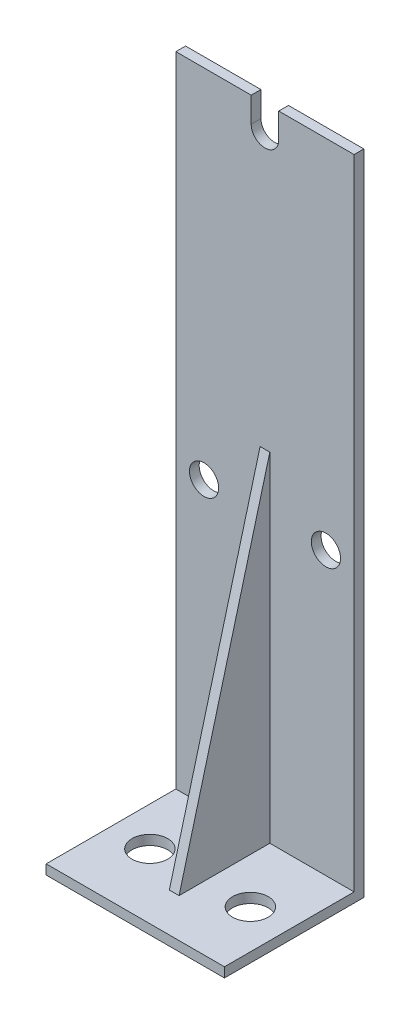
ISO-10303-21;
HEADER;
FILE_DESCRIPTION(('STEP AP214'),'2;1');
FILE_NAME('part.step','',(''),(''),'','','');
FILE_SCHEMA(('AUTOMOTIVE_DESIGN { 1 0 10303 214 1 1 1 1 }'));
ENDSEC;
DATA;
#1=APPLICATION_CONTEXT('core data for automotive mechanical design processes');
#2=APPLICATION_PROTOCOL_DEFINITION('international standard','automotive_design',2000,#1);
#3=PRODUCT_CONTEXT('',#1,'mechanical');
#4=PRODUCT('Part','Part','',(#3));
#5=PRODUCT_RELATED_PRODUCT_CATEGORY('part','',(#4));
#6=PRODUCT_DEFINITION_FORMATION('','',#4);
#7=PRODUCT_DEFINITION_CONTEXT('part definition',#1,'design');
#8=PRODUCT_DEFINITION('design','',#6,#7);
#9=PRODUCT_DEFINITION_SHAPE('','',#8);
#10=(LENGTH_UNIT() NAMED_UNIT(*) SI_UNIT(.MILLI.,.METRE.));
#11=(NAMED_UNIT(*) PLANE_ANGLE_UNIT() SI_UNIT($,.RADIAN.));
#12=(NAMED_UNIT(*) SI_UNIT($,.STERADIAN.) SOLID_ANGLE_UNIT());
#13=UNCERTAINTY_MEASURE_WITH_UNIT(LENGTH_MEASURE(1.E-05),#10,'distance_accuracy_value','');
#14=(GEOMETRIC_REPRESENTATION_CONTEXT(3) GLOBAL_UNCERTAINTY_ASSIGNED_CONTEXT((#13)) GLOBAL_UNIT_ASSIGNED_CONTEXT((#10,
#11,#12)) REPRESENTATION_CONTEXT('',''));
#15=CARTESIAN_POINT('',(0.,0.,0.));
#16=DIRECTION('',(0.,0.,1.));
#17=DIRECTION('',(1.,0.,0.));
#18=AXIS2_PLACEMENT_3D('',#15,#16,#17);
#19=CARTESIAN_POINT('',(0.,200.,1.5));
#20=DIRECTION('',(0.,-1.,0.));
#21=DIRECTION('',(0.,0.,-1.));
#22=AXIS2_PLACEMENT_3D('',#19,#20,#21);
#23=PLANE('',#22);
#24=DIRECTION('',(-1.,0.,0.));
#25=VECTOR('',#24,1.);
#26=CARTESIAN_POINT('',(0.,200.,-1.5));
#27=LINE('',#26,#25);
#28=CARTESIAN_POINT('',(55.,200.,-1.5));
#29=VERTEX_POINT('',#28);
#30=CARTESIAN_POINT('',(31.75,200.,-1.5));
#31=VERTEX_POINT('',#30);
#32=EDGE_CURVE('E233',#29,#31,#27,.T.);
#33=ORIENTED_EDGE('',*,*,#32,.T.);
#34=DIRECTION('',(0.,0.,-1.));
#35=VECTOR('',#34,1.);
#36=CARTESIAN_POINT('',(31.75,200.,41.5));
#37=LINE('',#36,#35);
#38=CARTESIAN_POINT('',(31.75,200.,1.5));
#39=VERTEX_POINT('',#38);
#40=EDGE_CURVE('E155',#39,#31,#37,.T.);
#41=ORIENTED_EDGE('',*,*,#40,.F.);
#42=DIRECTION('',(-1.,0.,0.));
#43=VECTOR('',#42,1.);
#44=CARTESIAN_POINT('',(0.,200.,1.5));
#45=LINE('',#44,#43);
#46=CARTESIAN_POINT('',(55.,200.,1.5));
#47=VERTEX_POINT('',#46);
#48=EDGE_CURVE('E236',#47,#39,#45,.T.);
#49=ORIENTED_EDGE('',*,*,#48,.F.);
#50=DIRECTION('',(0.,0.,-1.));
#51=VECTOR('',#50,1.);
#52=CARTESIAN_POINT('',(55.,200.,1.5));
#53=LINE('',#52,#51);
#54=EDGE_CURVE('E250',#47,#29,#53,.T.);
#55=ORIENTED_EDGE('',*,*,#54,.T.);
#56=EDGE_LOOP('',(#33,#41,#49,#55));
#57=FACE_BOUND('',#56,.T.);
#58=ADVANCED_FACE('F33',(#57),#23,.F.);
#59=CARTESIAN_POINT('',(0.,0.,1.5));
#60=DIRECTION('',(0.,0.,-1.));
#61=DIRECTION('',(-1.,0.,0.));
#62=AXIS2_PLACEMENT_3D('',#59,#60,#61);
#63=PLANE('',#62);
#64=ORIENTED_EDGE('',*,*,#48,.T.);
#65=DIRECTION('',(0.,-1.,0.));
#66=VECTOR('',#65,1.);
#67=CARTESIAN_POINT('',(31.7499999999998,0.,1.5));
#68=LINE('',#67,#66);
#69=CARTESIAN_POINT('',(31.75,192.25,1.5));
#70=VERTEX_POINT('',#69);
#71=EDGE_CURVE('E173',#39,#70,#68,.T.);
#72=ORIENTED_EDGE('',*,*,#71,.T.);
#73=CARTESIAN_POINT('',(27.5,192.25,1.5));
#74=DIRECTION('',(0.,0.,-1.));
#75=DIRECTION('',(-1.,0.,0.));
#76=AXIS2_PLACEMENT_3D('',#73,#74,#75);
#77=CIRCLE('',#76,4.25);
#78=CARTESIAN_POINT('',(23.25,192.25,1.5));
#79=VERTEX_POINT('',#78);
#80=EDGE_CURVE('E170',#70,#79,#77,.T.);
#81=ORIENTED_EDGE('',*,*,#80,.T.);
#82=DIRECTION('',(0.,1.,0.));
#83=VECTOR('',#82,1.);
#84=CARTESIAN_POINT('',(23.25,0.,1.5));
#85=LINE('',#84,#83);
#86=CARTESIAN_POINT('',(23.25,200.,1.5));
#87=VERTEX_POINT('',#86);
#88=EDGE_CURVE('E135',#79,#87,#85,.T.);
#89=ORIENTED_EDGE('',*,*,#88,.T.);
#90=CARTESIAN_POINT('',(0.,200.,1.5));
#91=VERTEX_POINT('',#90);
#92=EDGE_CURVE('E235',#87,#91,#45,.T.);
#93=ORIENTED_EDGE('',*,*,#92,.T.);
#94=DIRECTION('',(0.,-1.,0.));
#95=VECTOR('',#94,1.);
#96=CARTESIAN_POINT('',(0.,0.,1.5));
#97=LINE('',#96,#95);
#98=CARTESIAN_POINT('',(0.,3.,1.5));
#99=VERTEX_POINT('',#98);
#100=EDGE_CURVE('E230',#91,#99,#97,.T.);
#101=ORIENTED_EDGE('',*,*,#100,.T.);
#102=DIRECTION('',(-1.,0.,0.));
#103=VECTOR('',#102,1.);
#104=CARTESIAN_POINT('',(0.,3.,1.5));
#105=LINE('',#104,#103);
#106=CARTESIAN_POINT('',(26.,3.,1.5));
#107=VERTEX_POINT('',#106);
#108=EDGE_CURVE('E188',#107,#99,#105,.T.);
#109=ORIENTED_EDGE('',*,*,#108,.F.);
#110=DIRECTION('',(0.,1.,0.));
#111=VECTOR('',#110,1.);
#112=CARTESIAN_POINT('',(26.,3.,1.5));
#113=LINE('',#112,#111);
#114=CARTESIAN_POINT('',(26.,107.497422611928,1.5));
#115=VERTEX_POINT('',#114);
#116=EDGE_CURVE('E220',#107,#115,#113,.T.);
#117=ORIENTED_EDGE('',*,*,#116,.T.);
#118=DIRECTION('',(-1.,0.,0.));
#119=VECTOR('',#118,1.);
#120=CARTESIAN_POINT('',(29.,107.497422611928,1.5));
#121=LINE('',#120,#119);
#122=CARTESIAN_POINT('',(29.,107.497422611928,1.5));
#123=VERTEX_POINT('',#122);
#124=EDGE_CURVE('E226',#123,#115,#121,.T.);
#125=ORIENTED_EDGE('',*,*,#124,.F.);
#126=DIRECTION('',(0.,1.,0.));
#127=VECTOR('',#126,1.);
#128=CARTESIAN_POINT('',(29.,3.,1.5));
#129=LINE('',#128,#127);
#130=CARTESIAN_POINT('',(29.,3.,1.5));
#131=VERTEX_POINT('',#130);
#132=EDGE_CURVE('E210',#131,#123,#129,.T.);
#133=ORIENTED_EDGE('',*,*,#132,.F.);
#134=CARTESIAN_POINT('',(55.,3.,1.5));
#135=VERTEX_POINT('',#134);
#136=EDGE_CURVE('E56',#135,#131,#105,.T.);
#137=ORIENTED_EDGE('',*,*,#136,.F.);
#138=DIRECTION('',(0.,1.,0.));
#139=VECTOR('',#138,1.);
#140=CARTESIAN_POINT('',(55.,0.,1.5));
#141=LINE('',#140,#139);
#142=EDGE_CURVE('E232',#135,#47,#141,.T.);
#143=ORIENTED_EDGE('',*,*,#142,.T.);
#144=EDGE_LOOP('',(#64,#72,#81,#89,#93,#101,#109,#117,#125,#133,#137,#143));
#145=FACE_BOUND('',#144,.T.);
#146=CARTESIAN_POINT('',(46.3,90.,1.5));
#147=DIRECTION('',(0.,0.,-1.));
#148=DIRECTION('',(-1.,0.,0.));
#149=AXIS2_PLACEMENT_3D('',#146,#147,#148);
#150=CIRCLE('',#149,4.5);
#151=CARTESIAN_POINT('',(41.8,90.,1.5));
#152=VERTEX_POINT('',#151);
#153=EDGE_CURVE('E167',#152,#152,#150,.T.);
#154=ORIENTED_EDGE('',*,*,#153,.T.);
#155=EDGE_LOOP('',(#154));
#156=FACE_BOUND('',#155,.T.);
#157=CARTESIAN_POINT('',(8.7,90.,1.5));
#158=DIRECTION('',(0.,0.,-1.));
#159=DIRECTION('',(-1.,0.,0.));
#160=AXIS2_PLACEMENT_3D('',#157,#158,#159);
#161=CIRCLE('',#160,4.5);
#162=CARTESIAN_POINT('',(4.2,90.,1.5));
#163=VERTEX_POINT('',#162);
#164=EDGE_CURVE('E157',#163,#163,#161,.T.);
#165=ORIENTED_EDGE('',*,*,#164,.T.);
#166=EDGE_LOOP('',(#165));
#167=FACE_BOUND('',#166,.T.);
#168=ADVANCED_FACE('F283',(#145,#156,#167),#63,.F.);
#169=CARTESIAN_POINT('',(0.,0.,1.5));
#170=DIRECTION('',(1.,0.,0.));
#171=DIRECTION('',(0.,0.,-1.));
#172=AXIS2_PLACEMENT_3D('',#169,#170,#171);
#173=PLANE('',#172);
#174=DIRECTION('',(0.,-1.,0.));
#175=VECTOR('',#174,1.);
#176=CARTESIAN_POINT('',(0.,0.,-1.5));
#177=LINE('',#176,#175);
#178=CARTESIAN_POINT('',(0.,200.,-1.5));
#179=VERTEX_POINT('',#178);
#180=CARTESIAN_POINT('',(0.,0.,-1.5));
#181=VERTEX_POINT('',#180);
#182=EDGE_CURVE('E229',#179,#181,#177,.T.);
#183=ORIENTED_EDGE('',*,*,#182,.T.);
#184=DIRECTION('',(0.,0.,-1.));
#185=VECTOR('',#184,1.);
#186=CARTESIAN_POINT('',(0.,0.,1.5));
#187=LINE('',#186,#185);
#188=CARTESIAN_POINT('',(0.,0.,41.5));
#189=VERTEX_POINT('',#188);
#190=EDGE_CURVE('E11',#189,#181,#187,.T.);
#191=ORIENTED_EDGE('',*,*,#190,.F.);
#192=DIRECTION('',(0.,-1.,0.));
#193=VECTOR('',#192,1.);
#194=CARTESIAN_POINT('',(0.,0.,41.5));
#195=LINE('',#194,#193);
#196=CARTESIAN_POINT('',(0.,3.,41.5));
#197=VERTEX_POINT('',#196);
#198=EDGE_CURVE('E189',#197,#189,#195,.T.);
#199=ORIENTED_EDGE('',*,*,#198,.F.);
#200=DIRECTION('',(0.,0.,-1.));
#201=VECTOR('',#200,1.);
#202=CARTESIAN_POINT('',(0.,3.,41.5));
#203=LINE('',#202,#201);
#204=EDGE_CURVE('E199',#197,#99,#203,.T.);
#205=ORIENTED_EDGE('',*,*,#204,.T.);
#206=ORIENTED_EDGE('',*,*,#100,.F.);
#207=DIRECTION('',(0.,0.,-1.));
#208=VECTOR('',#207,1.);
#209=CARTESIAN_POINT('',(0.,200.,1.5));
#210=LINE('',#209,#208);
#211=EDGE_CURVE('E239',#91,#179,#210,.T.);
#212=ORIENTED_EDGE('',*,*,#211,.T.);
#213=EDGE_LOOP('',(#183,#191,#199,#205,#206,#212));
#214=FACE_BOUND('',#213,.T.);
#215=ADVANCED_FACE('F35',(#214),#173,.F.);
#216=CARTESIAN_POINT('',(0.,0.,1.5));
#217=DIRECTION('',(0.,1.,0.));
#218=DIRECTION('',(0.,0.,1.));
#219=AXIS2_PLACEMENT_3D('',#216,#217,#218);
#220=PLANE('',#219);
#221=DIRECTION('',(1.,0.,0.));
#222=VECTOR('',#221,1.);
#223=CARTESIAN_POINT('',(0.,0.,-1.5));
#224=LINE('',#223,#222);
#225=CARTESIAN_POINT('',(55.,0.,-1.5));
#226=VERTEX_POINT('',#225);
#227=EDGE_CURVE('E242',#181,#226,#224,.T.);
#228=ORIENTED_EDGE('',*,*,#227,.T.);
#229=DIRECTION('',(0.,0.,-1.));
#230=VECTOR('',#229,1.);
#231=CARTESIAN_POINT('',(55.,0.,1.5));
#232=LINE('',#231,#230);
#233=CARTESIAN_POINT('',(55.,0.,41.5));
#234=VERTEX_POINT('',#233);
#235=EDGE_CURVE('E41',#234,#226,#232,.T.);
#236=ORIENTED_EDGE('',*,*,#235,.F.);
#237=DIRECTION('',(1.,0.,0.));
#238=VECTOR('',#237,1.);
#239=CARTESIAN_POINT('',(0.,0.,41.5));
#240=LINE('',#239,#238);
#241=EDGE_CURVE('E192',#189,#234,#240,.T.);
#242=ORIENTED_EDGE('',*,*,#241,.F.);
#243=ORIENTED_EDGE('',*,*,#190,.T.);
#244=EDGE_LOOP('',(#228,#236,#242,#243));
#245=FACE_BOUND('',#244,.T.);
#246=CARTESIAN_POINT('',(12.,0.,21.5));
#247=DIRECTION('',(0.,1.,0.));
#248=DIRECTION('',(0.,0.,1.));
#249=AXIS2_PLACEMENT_3D('',#246,#247,#248);
#250=CIRCLE('',#249,5.5);
#251=CARTESIAN_POINT('',(12.,0.,27.));
#252=VERTEX_POINT('',#251);
#253=EDGE_CURVE('E185',#252,#252,#250,.T.);
#254=ORIENTED_EDGE('',*,*,#253,.T.);
#255=EDGE_LOOP('',(#254));
#256=FACE_BOUND('',#255,.T.);
#257=CARTESIAN_POINT('',(43.,0.,21.5));
#258=DIRECTION('',(0.,1.,0.));
#259=DIRECTION('',(0.,0.,1.));
#260=AXIS2_PLACEMENT_3D('',#257,#258,#259);
#261=CIRCLE('',#260,5.5);
#262=CARTESIAN_POINT('',(43.,0.,27.));
#263=VERTEX_POINT('',#262);
#264=EDGE_CURVE('E180',#263,#263,#261,.T.);
#265=ORIENTED_EDGE('',*,*,#264,.T.);
#266=EDGE_LOOP('',(#265));
#267=FACE_BOUND('',#266,.T.);
#268=ADVANCED_FACE('F275',(#245,#256,#267),#220,.F.);
#269=CARTESIAN_POINT('',(55.,0.,1.5));
#270=DIRECTION('',(-1.,0.,0.));
#271=DIRECTION('',(0.,0.,1.));
#272=AXIS2_PLACEMENT_3D('',#269,#270,#271);
#273=PLANE('',#272);
#274=DIRECTION('',(0.,1.,0.));
#275=VECTOR('',#274,1.);
#276=CARTESIAN_POINT('',(55.,0.,-1.5));
#277=LINE('',#276,#275);
#278=EDGE_CURVE('E244',#226,#29,#277,.T.);
#279=ORIENTED_EDGE('',*,*,#278,.T.);
#280=ORIENTED_EDGE('',*,*,#54,.F.);
#281=ORIENTED_EDGE('',*,*,#142,.F.);
#282=DIRECTION('',(0.,0.,-1.));
#283=VECTOR('',#282,1.);
#284=CARTESIAN_POINT('',(55.,3.,41.5));
#285=LINE('',#284,#283);
#286=CARTESIAN_POINT('',(55.,3.,41.5));
#287=VERTEX_POINT('',#286);
#288=EDGE_CURVE('E203',#287,#135,#285,.T.);
#289=ORIENTED_EDGE('',*,*,#288,.F.);
#290=DIRECTION('',(0.,1.,0.));
#291=VECTOR('',#290,1.);
#292=CARTESIAN_POINT('',(55.,0.,41.5));
#293=LINE('',#292,#291);
#294=EDGE_CURVE('E195',#234,#287,#293,.T.);
#295=ORIENTED_EDGE('',*,*,#294,.F.);
#296=ORIENTED_EDGE('',*,*,#235,.T.);
#297=EDGE_LOOP('',(#279,#280,#281,#289,#295,#296));
#298=FACE_BOUND('',#297,.T.);
#299=ADVANCED_FACE('F256',(#298),#273,.F.);
#300=ORIENTED_EDGE('',*,*,#92,.F.);
#301=DIRECTION('',(0.,0.,-1.));
#302=VECTOR('',#301,1.);
#303=CARTESIAN_POINT('',(23.25,200.,41.5));
#304=LINE('',#303,#302);
#305=CARTESIAN_POINT('',(23.25,200.,-1.5));
#306=VERTEX_POINT('',#305);
#307=EDGE_CURVE('E138',#87,#306,#304,.T.);
#308=ORIENTED_EDGE('',*,*,#307,.T.);
#309=EDGE_CURVE('E150',#306,#179,#27,.T.);
#310=ORIENTED_EDGE('',*,*,#309,.T.);
#311=ORIENTED_EDGE('',*,*,#211,.F.);
#312=EDGE_LOOP('',(#300,#308,#310,#311));
#313=FACE_BOUND('',#312,.T.);
#314=ADVANCED_FACE('F282',(#313),#23,.F.);
#315=CARTESIAN_POINT('',(0.,0.,-1.5));
#316=DIRECTION('',(0.,0.,-1.));
#317=DIRECTION('',(-1.,0.,0.));
#318=AXIS2_PLACEMENT_3D('',#315,#316,#317);
#319=PLANE('',#318);
#320=DIRECTION('',(0.,-1.,0.));
#321=VECTOR('',#320,1.);
#322=CARTESIAN_POINT('',(31.7499999999998,0.,-1.5));
#323=LINE('',#322,#321);
#324=CARTESIAN_POINT('',(31.75,192.25,-1.5));
#325=VERTEX_POINT('',#324);
#326=EDGE_CURVE('E48',#31,#325,#323,.T.);
#327=ORIENTED_EDGE('',*,*,#326,.F.);
#328=ORIENTED_EDGE('',*,*,#32,.F.);
#329=ORIENTED_EDGE('',*,*,#278,.F.);
#330=ORIENTED_EDGE('',*,*,#227,.F.);
#331=ORIENTED_EDGE('',*,*,#182,.F.);
#332=ORIENTED_EDGE('',*,*,#309,.F.);
#333=DIRECTION('',(0.,1.,0.));
#334=VECTOR('',#333,1.);
#335=CARTESIAN_POINT('',(23.25,0.,-1.5));
#336=LINE('',#335,#334);
#337=CARTESIAN_POINT('',(23.25,192.25,-1.5));
#338=VERTEX_POINT('',#337);
#339=EDGE_CURVE('E132',#338,#306,#336,.T.);
#340=ORIENTED_EDGE('',*,*,#339,.F.);
#341=CARTESIAN_POINT('',(27.5,192.25,-1.5));
#342=DIRECTION('',(0.,0.,-1.));
#343=DIRECTION('',(-1.,0.,0.));
#344=AXIS2_PLACEMENT_3D('',#341,#342,#343);
#345=CIRCLE('',#344,4.25);
#346=EDGE_CURVE('E142',#325,#338,#345,.T.);
#347=ORIENTED_EDGE('',*,*,#346,.F.);
#348=EDGE_LOOP('',(#327,#328,#329,#330,#331,#332,#340,#347));
#349=FACE_BOUND('',#348,.T.);
#350=CARTESIAN_POINT('',(46.3,90.,-1.5));
#351=DIRECTION('',(0.,0.,-1.));
#352=DIRECTION('',(-1.,0.,0.));
#353=AXIS2_PLACEMENT_3D('',#350,#351,#352);
#354=CIRCLE('',#353,4.5);
#355=CARTESIAN_POINT('',(41.8,90.,-1.5));
#356=VERTEX_POINT('',#355);
#357=EDGE_CURVE('E159',#356,#356,#354,.T.);
#358=ORIENTED_EDGE('',*,*,#357,.F.);
#359=EDGE_LOOP('',(#358));
#360=FACE_BOUND('',#359,.T.);
#361=CARTESIAN_POINT('',(8.7,90.,-1.5));
#362=DIRECTION('',(0.,0.,-1.));
#363=DIRECTION('',(-1.,0.,0.));
#364=AXIS2_PLACEMENT_3D('',#361,#362,#363);
#365=CIRCLE('',#364,4.5);
#366=CARTESIAN_POINT('',(4.2,90.,-1.5));
#367=VERTEX_POINT('',#366);
#368=EDGE_CURVE('E162',#367,#367,#365,.T.);
#369=ORIENTED_EDGE('',*,*,#368,.F.);
#370=EDGE_LOOP('',(#369));
#371=FACE_BOUND('',#370,.T.);
#372=ADVANCED_FACE('F147',(#349,#360,#371),#319,.T.);
#373=CARTESIAN_POINT('',(29.,3.,29.5));
#374=DIRECTION('',(0.,0.258819045102521,0.965925826289068));
#375=DIRECTION('',(0.,-0.965925826289068,0.258819045102521));
#376=AXIS2_PLACEMENT_3D('',#373,#374,#375);
#377=PLANE('',#376);
#378=DIRECTION('',(0.,0.965925826289068,-0.258819045102521));
#379=VECTOR('',#378,1.);
#380=CARTESIAN_POINT('',(26.,3.,29.5));
#381=LINE('',#380,#379);
#382=CARTESIAN_POINT('',(26.,3.,29.5));
#383=VERTEX_POINT('',#382);
#384=EDGE_CURVE('E211',#383,#115,#381,.T.);
#385=ORIENTED_EDGE('',*,*,#384,.F.);
#386=DIRECTION('',(-1.,0.,0.));
#387=VECTOR('',#386,1.);
#388=CARTESIAN_POINT('',(29.,3.,29.5));
#389=LINE('',#388,#387);
#390=CARTESIAN_POINT('',(29.,3.,29.5));
#391=VERTEX_POINT('',#390);
#392=EDGE_CURVE('E217',#391,#383,#389,.T.);
#393=ORIENTED_EDGE('',*,*,#392,.F.);
#394=DIRECTION('',(0.,0.965925826289068,-0.258819045102521));
#395=VECTOR('',#394,1.);
#396=CARTESIAN_POINT('',(29.,3.,29.5));
#397=LINE('',#396,#395);
#398=EDGE_CURVE('E214',#391,#123,#397,.T.);
#399=ORIENTED_EDGE('',*,*,#398,.T.);
#400=ORIENTED_EDGE('',*,*,#124,.T.);
#401=EDGE_LOOP('',(#385,#393,#399,#400));
#402=FACE_BOUND('',#401,.T.);
#403=ADVANCED_FACE('F311',(#402),#377,.T.);
#404=CARTESIAN_POINT('',(29.,0.,0.));
#405=DIRECTION('',(1.,0.,0.));
#406=DIRECTION('',(0.,0.,-1.));
#407=AXIS2_PLACEMENT_3D('',#404,#405,#406);
#408=PLANE('',#407);
#409=DIRECTION('',(0.,0.,-1.));
#410=VECTOR('',#409,1.);
#411=CARTESIAN_POINT('',(29.,3.,29.5));
#412=LINE('',#411,#410);
#413=EDGE_CURVE('E207',#391,#131,#412,.T.);
#414=ORIENTED_EDGE('',*,*,#413,.T.);
#415=ORIENTED_EDGE('',*,*,#132,.T.);
#416=ORIENTED_EDGE('',*,*,#398,.F.);
#417=EDGE_LOOP('',(#414,#415,#416));
#418=FACE_BOUND('',#417,.T.);
#419=ADVANCED_FACE('F407',(#418),#408,.T.);
#420=CARTESIAN_POINT('',(26.,0.,0.));
#421=DIRECTION('',(1.,0.,0.));
#422=DIRECTION('',(0.,0.,-1.));
#423=AXIS2_PLACEMENT_3D('',#420,#421,#422);
#424=PLANE('',#423);
#425=DIRECTION('',(0.,0.,-1.));
#426=VECTOR('',#425,1.);
#427=CARTESIAN_POINT('',(26.,3.,29.5));
#428=LINE('',#427,#426);
#429=EDGE_CURVE('E206',#383,#107,#428,.T.);
#430=ORIENTED_EDGE('',*,*,#429,.F.);
#431=ORIENTED_EDGE('',*,*,#384,.T.);
#432=ORIENTED_EDGE('',*,*,#116,.F.);
#433=EDGE_LOOP('',(#430,#431,#432));
#434=FACE_BOUND('',#433,.T.);
#435=ADVANCED_FACE('F401',(#434),#424,.F.);
#436=CARTESIAN_POINT('',(0.,3.,41.5));
#437=DIRECTION('',(0.,-1.,0.));
#438=DIRECTION('',(0.,0.,-1.));
#439=AXIS2_PLACEMENT_3D('',#436,#437,#438);
#440=PLANE('',#439);
#441=ORIENTED_EDGE('',*,*,#413,.F.);
#442=ORIENTED_EDGE('',*,*,#392,.T.);
#443=ORIENTED_EDGE('',*,*,#429,.T.);
#444=ORIENTED_EDGE('',*,*,#108,.T.);
#445=ORIENTED_EDGE('',*,*,#204,.F.);
#446=DIRECTION('',(-1.,0.,0.));
#447=VECTOR('',#446,1.);
#448=CARTESIAN_POINT('',(0.,3.,41.5));
#449=LINE('',#448,#447);
#450=EDGE_CURVE('E197',#287,#197,#449,.T.);
#451=ORIENTED_EDGE('',*,*,#450,.F.);
#452=ORIENTED_EDGE('',*,*,#288,.T.);
#453=ORIENTED_EDGE('',*,*,#136,.T.);
#454=EDGE_LOOP('',(#441,#442,#443,#444,#445,#451,#452,#453));
#455=FACE_BOUND('',#454,.T.);
#456=CARTESIAN_POINT('',(12.,3.,21.5));
#457=DIRECTION('',(0.,1.,0.));
#458=DIRECTION('',(0.,0.,1.));
#459=AXIS2_PLACEMENT_3D('',#456,#457,#458);
#460=CIRCLE('',#459,5.5);
#461=CARTESIAN_POINT('',(12.,3.,27.));
#462=VERTEX_POINT('',#461);
#463=EDGE_CURVE('E177',#462,#462,#460,.T.);
#464=ORIENTED_EDGE('',*,*,#463,.F.);
#465=EDGE_LOOP('',(#464));
#466=FACE_BOUND('',#465,.T.);
#467=CARTESIAN_POINT('',(43.,3.,21.5));
#468=DIRECTION('',(0.,1.,0.));
#469=DIRECTION('',(0.,0.,1.));
#470=AXIS2_PLACEMENT_3D('',#467,#468,#469);
#471=CIRCLE('',#470,5.5);
#472=CARTESIAN_POINT('',(43.,3.,27.));
#473=VERTEX_POINT('',#472);
#474=EDGE_CURVE('E176',#473,#473,#471,.T.);
#475=ORIENTED_EDGE('',*,*,#474,.F.);
#476=EDGE_LOOP('',(#475));
#477=FACE_BOUND('',#476,.T.);
#478=ADVANCED_FACE('F268',(#455,#466,#477),#440,.F.);
#479=CARTESIAN_POINT('',(0.,0.,41.5));
#480=DIRECTION('',(0.,0.,-1.));
#481=DIRECTION('',(-1.,0.,0.));
#482=AXIS2_PLACEMENT_3D('',#479,#480,#481);
#483=PLANE('',#482);
#484=ORIENTED_EDGE('',*,*,#198,.T.);
#485=ORIENTED_EDGE('',*,*,#241,.T.);
#486=ORIENTED_EDGE('',*,*,#294,.T.);
#487=ORIENTED_EDGE('',*,*,#450,.T.);
#488=EDGE_LOOP('',(#484,#485,#486,#487));
#489=FACE_BOUND('',#488,.T.);
#490=ADVANCED_FACE('F274',(#489),#483,.F.);
#491=CARTESIAN_POINT('',(43.,-17.,21.5));
#492=DIRECTION('',(0.,1.,0.));
#493=DIRECTION('',(0.,0.,1.));
#494=AXIS2_PLACEMENT_3D('',#491,#492,#493);
#495=CYLINDRICAL_SURFACE('',#494,5.5);
#496=ORIENTED_EDGE('',*,*,#474,.T.);
#497=EDGE_LOOP('',(#496));
#498=FACE_BOUND('',#497,.T.);
#499=ORIENTED_EDGE('',*,*,#264,.F.);
#500=EDGE_LOOP('',(#499));
#501=FACE_BOUND('',#500,.T.);
#502=ADVANCED_FACE('F380',(#498,#501),#495,.F.);
#503=CARTESIAN_POINT('',(12.,-17.,21.5));
#504=DIRECTION('',(0.,1.,0.));
#505=DIRECTION('',(0.,0.,1.));
#506=AXIS2_PLACEMENT_3D('',#503,#504,#505);
#507=CYLINDRICAL_SURFACE('',#506,5.5);
#508=ORIENTED_EDGE('',*,*,#463,.T.);
#509=EDGE_LOOP('',(#508));
#510=FACE_BOUND('',#509,.T.);
#511=ORIENTED_EDGE('',*,*,#253,.F.);
#512=EDGE_LOOP('',(#511));
#513=FACE_BOUND('',#512,.T.);
#514=ADVANCED_FACE('F349',(#510,#513),#507,.F.);
#515=CARTESIAN_POINT('',(8.7,90.,41.5));
#516=DIRECTION('',(0.,0.,-1.));
#517=DIRECTION('',(-1.,0.,0.));
#518=AXIS2_PLACEMENT_3D('',#515,#516,#517);
#519=CYLINDRICAL_SURFACE('',#518,4.5);
#520=ORIENTED_EDGE('',*,*,#368,.T.);
#521=EDGE_LOOP('',(#520));
#522=FACE_BOUND('',#521,.T.);
#523=ORIENTED_EDGE('',*,*,#164,.F.);
#524=EDGE_LOOP('',(#523));
#525=FACE_BOUND('',#524,.T.);
#526=ADVANCED_FACE('F294',(#522,#525),#519,.F.);
#527=CARTESIAN_POINT('',(46.3,90.,41.5));
#528=DIRECTION('',(0.,0.,-1.));
#529=DIRECTION('',(-1.,0.,0.));
#530=AXIS2_PLACEMENT_3D('',#527,#528,#529);
#531=CYLINDRICAL_SURFACE('',#530,4.5);
#532=ORIENTED_EDGE('',*,*,#357,.T.);
#533=EDGE_LOOP('',(#532));
#534=FACE_BOUND('',#533,.T.);
#535=ORIENTED_EDGE('',*,*,#153,.F.);
#536=EDGE_LOOP('',(#535));
#537=FACE_BOUND('',#536,.T.);
#538=ADVANCED_FACE('F287',(#534,#537),#531,.F.);
#539=CARTESIAN_POINT('',(31.7499999999998,0.,41.5));
#540=DIRECTION('',(1.,0.,0.));
#541=DIRECTION('',(0.,1.,0.));
#542=AXIS2_PLACEMENT_3D('',#539,#540,#541);
#543=PLANE('',#542);
#544=ORIENTED_EDGE('',*,*,#40,.T.);
#545=ORIENTED_EDGE('',*,*,#326,.T.);
#546=DIRECTION('',(0.,0.,-1.));
#547=VECTOR('',#546,1.);
#548=CARTESIAN_POINT('',(31.75,192.25,41.5));
#549=LINE('',#548,#547);
#550=EDGE_CURVE('E139',#70,#325,#549,.T.);
#551=ORIENTED_EDGE('',*,*,#550,.F.);
#552=ORIENTED_EDGE('',*,*,#71,.F.);
#553=EDGE_LOOP('',(#544,#545,#551,#552));
#554=FACE_BOUND('',#553,.T.);
#555=ADVANCED_FACE('F285',(#554),#543,.F.);
#556=CARTESIAN_POINT('',(23.25,0.,41.5));
#557=DIRECTION('',(-1.,0.,0.));
#558=DIRECTION('',(0.,0.,1.));
#559=AXIS2_PLACEMENT_3D('',#556,#557,#558);
#560=PLANE('',#559);
#561=DIRECTION('',(0.,0.,-1.));
#562=VECTOR('',#561,1.);
#563=CARTESIAN_POINT('',(23.25,192.25,41.5));
#564=LINE('',#563,#562);
#565=EDGE_CURVE('E128',#79,#338,#564,.T.);
#566=ORIENTED_EDGE('',*,*,#565,.T.);
#567=ORIENTED_EDGE('',*,*,#339,.T.);
#568=ORIENTED_EDGE('',*,*,#307,.F.);
#569=ORIENTED_EDGE('',*,*,#88,.F.);
#570=EDGE_LOOP('',(#566,#567,#568,#569));
#571=FACE_BOUND('',#570,.T.);
#572=ADVANCED_FACE('F130',(#571),#560,.F.);
#573=CARTESIAN_POINT('',(27.5,192.25,41.5));
#574=DIRECTION('',(0.,0.,-1.));
#575=DIRECTION('',(-1.,0.,0.));
#576=AXIS2_PLACEMENT_3D('',#573,#574,#575);
#577=CYLINDRICAL_SURFACE('',#576,4.25);
#578=ORIENTED_EDGE('',*,*,#550,.T.);
#579=ORIENTED_EDGE('',*,*,#346,.T.);
#580=ORIENTED_EDGE('',*,*,#565,.F.);
#581=ORIENTED_EDGE('',*,*,#80,.F.);
#582=EDGE_LOOP('',(#578,#579,#580,#581));
#583=FACE_BOUND('',#582,.T.);
#584=ADVANCED_FACE('F143',(#583),#577,.F.);
#585=CLOSED_SHELL('',(#58,#168,#215,#268,#299,#314,#372,#403,#419,#435,#478,#490,#502,#514,#526,
#538,#555,#572,#584));
#586=MANIFOLD_SOLID_BREP('B2',#585);
#587=ADVANCED_BREP_SHAPE_REPRESENTATION('',(#18,#586),#14);
#588=SHAPE_DEFINITION_REPRESENTATION(#9,#587);
ENDSEC;
END-ISO-10303-21;
